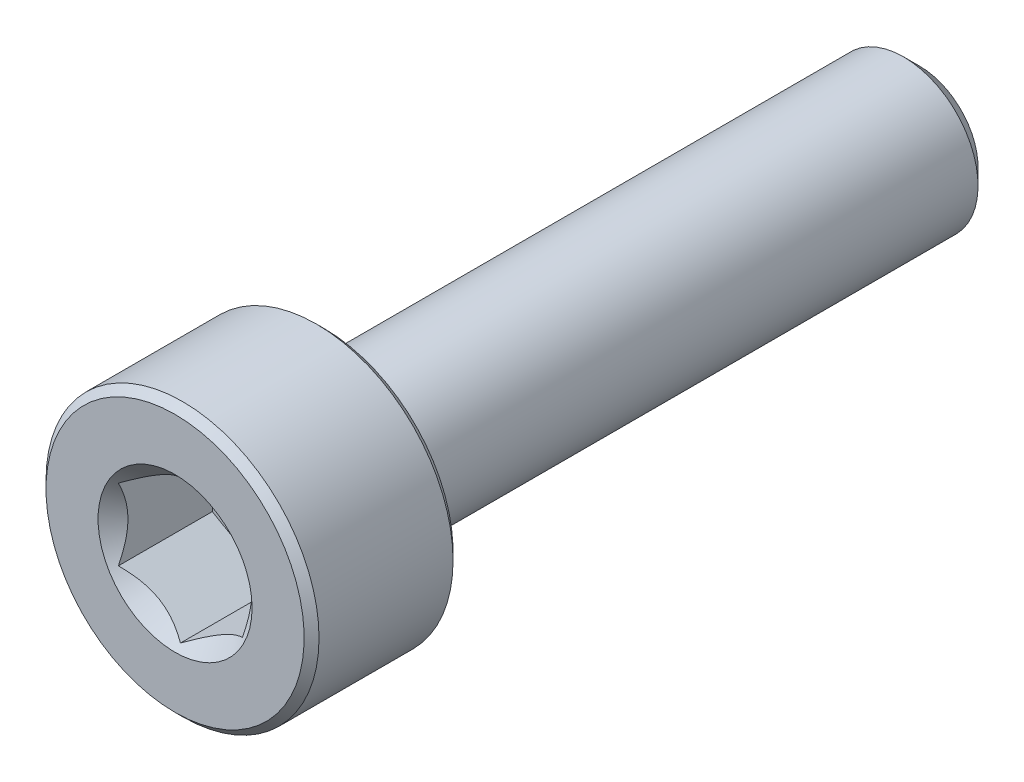
ISO-10303-21;
HEADER;
FILE_DESCRIPTION(('STEP AP214'),'2;1');
FILE_NAME('part.step','',(''),(''),'','','');
FILE_SCHEMA(('AUTOMOTIVE_DESIGN { 1 0 10303 214 1 1 1 1 }'));
ENDSEC;
DATA;
#1=APPLICATION_CONTEXT('core data for automotive mechanical design processes');
#2=APPLICATION_PROTOCOL_DEFINITION('international standard','automotive_design',2000,#1);
#3=PRODUCT_CONTEXT('',#1,'mechanical');
#4=PRODUCT('Part','Part','',(#3));
#5=PRODUCT_RELATED_PRODUCT_CATEGORY('part','',(#4));
#6=PRODUCT_DEFINITION_FORMATION('','',#4);
#7=PRODUCT_DEFINITION_CONTEXT('part definition',#1,'design');
#8=PRODUCT_DEFINITION('design','',#6,#7);
#9=PRODUCT_DEFINITION_SHAPE('','',#8);
#10=(LENGTH_UNIT() NAMED_UNIT(*) SI_UNIT(.MILLI.,.METRE.));
#11=(NAMED_UNIT(*) PLANE_ANGLE_UNIT() SI_UNIT($,.RADIAN.));
#12=(NAMED_UNIT(*) SI_UNIT($,.STERADIAN.) SOLID_ANGLE_UNIT());
#13=UNCERTAINTY_MEASURE_WITH_UNIT(LENGTH_MEASURE(1.E-05),#10,'distance_accuracy_value','');
#14=(GEOMETRIC_REPRESENTATION_CONTEXT(3) GLOBAL_UNCERTAINTY_ASSIGNED_CONTEXT((#13)) GLOBAL_UNIT_ASSIGNED_CONTEXT((#10,
#11,#12)) REPRESENTATION_CONTEXT('',''));
#15=CARTESIAN_POINT('',(0.,0.,0.));
#16=DIRECTION('',(0.,0.,1.));
#17=DIRECTION('',(1.,0.,0.));
#18=AXIS2_PLACEMENT_3D('',#15,#16,#17);
#19=CARTESIAN_POINT('',(0.,1.17524047358084,-7.5));
#20=DIRECTION('',(0.,0.,-1.));
#21=DIRECTION('',(0.,1.,0.));
#22=AXIS2_PLACEMENT_3D('',#19,#20,#21);
#23=PLANE('',#22);
#24=CARTESIAN_POINT('',(0.,0.,-7.5));
#25=DIRECTION('',(0.,0.,-1.));
#26=DIRECTION('',(0.,1.,0.));
#27=AXIS2_PLACEMENT_3D('',#24,#25,#26);
#28=CIRCLE('',#27,1.17524047358084);
#29=CARTESIAN_POINT('',(0.,1.17524047358084,-7.5));
#30=VERTEX_POINT('',#29);
#31=EDGE_CURVE('E53',#30,#30,#28,.T.);
#32=ORIENTED_EDGE('',*,*,#31,.T.);
#33=EDGE_LOOP('',(#32));
#34=FACE_BOUND('',#33,.T.);
#35=ADVANCED_FACE('F40',(#34),#23,.T.);
#36=CARTESIAN_POINT('',(0.,0.,-7.5));
#37=DIRECTION('',(0.,0.,1.));
#38=DIRECTION('',(0.,-1.,0.));
#39=AXIS2_PLACEMENT_3D('',#36,#37,#38);
#40=CONICAL_SURFACE('',#39,1.17524047358084,0.785398163397446);
#41=CARTESIAN_POINT('',(0.,0.,-7.17524047358083));
#42=DIRECTION('',(0.,0.,-1.));
#43=DIRECTION('',(0.,1.,0.));
#44=AXIS2_PLACEMENT_3D('',#41,#42,#43);
#45=CIRCLE('',#44,1.5);
#46=CARTESIAN_POINT('',(0.,1.5,-7.17524047358083));
#47=VERTEX_POINT('',#46);
#48=EDGE_CURVE('E156',#47,#47,#45,.T.);
#49=ORIENTED_EDGE('',*,*,#48,.T.);
#50=EDGE_LOOP('',(#49));
#51=FACE_BOUND('',#50,.T.);
#52=ORIENTED_EDGE('',*,*,#31,.F.);
#53=EDGE_LOOP('',(#52));
#54=FACE_BOUND('',#53,.T.);
#55=ADVANCED_FACE('F162',(#51,#54),#40,.T.);
#56=CARTESIAN_POINT('',(0.,0.,-7.5));
#57=DIRECTION('',(0.,0.,-1.));
#58=DIRECTION('',(0.,1.,0.));
#59=AXIS2_PLACEMENT_3D('',#56,#57,#58);
#60=CYLINDRICAL_SURFACE('',#59,1.5);
#61=CARTESIAN_POINT('',(0.,0.,4.35));
#62=DIRECTION('',(0.,0.,-1.));
#63=DIRECTION('',(0.,1.,0.));
#64=AXIS2_PLACEMENT_3D('',#61,#62,#63);
#65=CIRCLE('',#64,1.5);
#66=CARTESIAN_POINT('',(0.,1.5,4.35));
#67=VERTEX_POINT('',#66);
#68=EDGE_CURVE('E153',#67,#67,#65,.T.);
#69=ORIENTED_EDGE('',*,*,#68,.T.);
#70=EDGE_LOOP('',(#69));
#71=FACE_BOUND('',#70,.T.);
#72=ORIENTED_EDGE('',*,*,#48,.F.);
#73=EDGE_LOOP('',(#72));
#74=FACE_BOUND('',#73,.T.);
#75=ADVANCED_FACE('F164',(#71,#74),#60,.T.);
#76=CARTESIAN_POINT('',(0.,0.,4.35));
#77=DIRECTION('',(0.,0.,-1.));
#78=DIRECTION('',(0.,1.,0.));
#79=AXIS2_PLACEMENT_3D('',#76,#77,#78);
#80=TOROIDAL_SURFACE('',#79,1.65,0.149999999999999);
#81=CARTESIAN_POINT('',(0.,0.,4.5));
#82=DIRECTION('',(0.,0.,-1.));
#83=DIRECTION('',(0.,1.,0.));
#84=AXIS2_PLACEMENT_3D('',#81,#82,#83);
#85=CIRCLE('',#84,1.65);
#86=CARTESIAN_POINT('',(0.,1.65,4.5));
#87=VERTEX_POINT('',#86);
#88=EDGE_CURVE('E150',#87,#87,#85,.T.);
#89=ORIENTED_EDGE('',*,*,#88,.T.);
#90=EDGE_LOOP('',(#89));
#91=FACE_BOUND('',#90,.T.);
#92=ORIENTED_EDGE('',*,*,#68,.F.);
#93=EDGE_LOOP('',(#92));
#94=FACE_BOUND('',#93,.T.);
#95=ADVANCED_FACE('F170',(#91,#94),#80,.F.);
#96=CARTESIAN_POINT('',(0.,2.6,4.5));
#97=DIRECTION('',(0.,0.,-1.));
#98=DIRECTION('',(0.,1.,0.));
#99=AXIS2_PLACEMENT_3D('',#96,#97,#98);
#100=PLANE('',#99);
#101=CARTESIAN_POINT('',(0.,0.,4.5));
#102=DIRECTION('',(0.,0.,-1.));
#103=DIRECTION('',(0.,1.,0.));
#104=AXIS2_PLACEMENT_3D('',#101,#102,#103);
#105=CIRCLE('',#104,2.6);
#106=CARTESIAN_POINT('',(0.,2.6,4.5));
#107=VERTEX_POINT('',#106);
#108=EDGE_CURVE('E147',#107,#107,#105,.T.);
#109=ORIENTED_EDGE('',*,*,#108,.T.);
#110=EDGE_LOOP('',(#109));
#111=FACE_BOUND('',#110,.T.);
#112=ORIENTED_EDGE('',*,*,#88,.F.);
#113=EDGE_LOOP('',(#112));
#114=FACE_BOUND('',#113,.T.);
#115=ADVANCED_FACE('F176',(#111,#114),#100,.T.);
#116=CARTESIAN_POINT('',(0.,0.,4.5));
#117=DIRECTION('',(0.,0.,1.));
#118=DIRECTION('',(0.,-1.,0.));
#119=AXIS2_PLACEMENT_3D('',#116,#117,#118);
#120=CONICAL_SURFACE('',#119,2.6,0.785398163397451);
#121=CARTESIAN_POINT('',(0.,0.,4.65));
#122=DIRECTION('',(0.,0.,-1.));
#123=DIRECTION('',(0.,1.,0.));
#124=AXIS2_PLACEMENT_3D('',#121,#122,#123);
#125=CIRCLE('',#124,2.75);
#126=CARTESIAN_POINT('',(0.,2.75,4.65));
#127=VERTEX_POINT('',#126);
#128=EDGE_CURVE('E144',#127,#127,#125,.T.);
#129=ORIENTED_EDGE('',*,*,#128,.T.);
#130=EDGE_LOOP('',(#129));
#131=FACE_BOUND('',#130,.T.);
#132=ORIENTED_EDGE('',*,*,#108,.F.);
#133=EDGE_LOOP('',(#132));
#134=FACE_BOUND('',#133,.T.);
#135=ADVANCED_FACE('F180',(#131,#134),#120,.T.);
#136=CARTESIAN_POINT('',(0.,0.,-7.5));
#137=DIRECTION('',(0.,0.,-1.));
#138=DIRECTION('',(0.,1.,0.));
#139=AXIS2_PLACEMENT_3D('',#136,#137,#138);
#140=CYLINDRICAL_SURFACE('',#139,2.75);
#141=CARTESIAN_POINT('',(0.,0.,7.35));
#142=DIRECTION('',(0.,0.,-1.));
#143=DIRECTION('',(0.,1.,0.));
#144=AXIS2_PLACEMENT_3D('',#141,#142,#143);
#145=CIRCLE('',#144,2.75);
#146=CARTESIAN_POINT('',(0.,2.75,7.35));
#147=VERTEX_POINT('',#146);
#148=EDGE_CURVE('E141',#147,#147,#145,.T.);
#149=ORIENTED_EDGE('',*,*,#148,.T.);
#150=EDGE_LOOP('',(#149));
#151=FACE_BOUND('',#150,.T.);
#152=ORIENTED_EDGE('',*,*,#128,.F.);
#153=EDGE_LOOP('',(#152));
#154=FACE_BOUND('',#153,.T.);
#155=ADVANCED_FACE('F184',(#151,#154),#140,.T.);
#156=CARTESIAN_POINT('',(0.,0.,7.35));
#157=DIRECTION('',(0.,0.,-1.));
#158=DIRECTION('',(0.,1.,0.));
#159=AXIS2_PLACEMENT_3D('',#156,#157,#158);
#160=CONICAL_SURFACE('',#159,2.75,0.785398163397445);
#161=CARTESIAN_POINT('',(0.,0.,7.5));
#162=DIRECTION('',(0.,0.,-1.));
#163=DIRECTION('',(0.,1.,0.));
#164=AXIS2_PLACEMENT_3D('',#161,#162,#163);
#165=CIRCLE('',#164,2.6);
#166=CARTESIAN_POINT('',(0.,2.6,7.5));
#167=VERTEX_POINT('',#166);
#168=EDGE_CURVE('E138',#167,#167,#165,.T.);
#169=ORIENTED_EDGE('',*,*,#168,.T.);
#170=EDGE_LOOP('',(#169));
#171=FACE_BOUND('',#170,.T.);
#172=ORIENTED_EDGE('',*,*,#148,.F.);
#173=EDGE_LOOP('',(#172));
#174=FACE_BOUND('',#173,.T.);
#175=ADVANCED_FACE('F188',(#171,#174),#160,.T.);
#176=CARTESIAN_POINT('',(0.,0.,7.5));
#177=DIRECTION('',(0.,0.,1.));
#178=DIRECTION('',(0.,-1.,0.));
#179=AXIS2_PLACEMENT_3D('',#176,#177,#178);
#180=PLANE('',#179);
#181=CARTESIAN_POINT('',(0.,0.,7.5));
#182=DIRECTION('',(0.,0.,1.));
#183=DIRECTION('',(1.,0.,0.));
#184=AXIS2_PLACEMENT_3D('',#181,#182,#183);
#185=CIRCLE('',#184,1.55162884844712);
#186=CARTESIAN_POINT('',(1.55162884844712,0.,7.5));
#187=VERTEX_POINT('',#186);
#188=EDGE_CURVE('E112',#187,#187,#185,.T.);
#189=ORIENTED_EDGE('',*,*,#188,.F.);
#190=EDGE_LOOP('',(#189));
#191=FACE_BOUND('',#190,.T.);
#192=ORIENTED_EDGE('',*,*,#168,.F.);
#193=EDGE_LOOP('',(#192));
#194=FACE_BOUND('',#193,.T.);
#195=ADVANCED_FACE('F192',(#191,#194),#180,.T.);
#196=CARTESIAN_POINT('',(0.,0.,7.5));
#197=DIRECTION('',(0.,0.,1.));
#198=DIRECTION('',(1.,0.,0.));
#199=AXIS2_PLACEMENT_3D('',#196,#197,#198);
#200=CONICAL_SURFACE('',#199,1.55162884844712,0.78539816339745);
#201=ORIENTED_EDGE('',*,*,#188,.T.);
#202=EDGE_LOOP('',(#201));
#203=FACE_BOUND('',#202,.T.);
#204=CARTESIAN_POINT('',(-0.000199999999999347,-1.4434911430279,7.39186230843608));
#205=CARTESIAN_POINT('',(0.0427751670715876,-1.41867941875065,7.36706849258205));
#206=CARTESIAN_POINT('',(0.086469004745949,-1.39345276980743,7.34373055894563));
#207=CARTESIAN_POINT('',(0.175565930841943,-1.34201263554194,7.30099882861148));
#208=CARTESIAN_POINT('',(0.220977498357065,-1.31579425481276,7.28162881688736));
#209=CARTESIAN_POINT('',(0.31254782093526,-1.26292610442246,7.24844730794042));
#210=CARTESIAN_POINT('',(0.358683240175886,-1.23628980770471,7.2345523835796));
#211=CARTESIAN_POINT('',(0.451970080407593,-1.18243062538508,7.21314410668758));
#212=CARTESIAN_POINT('',(0.499118649136381,-1.15520938653761,7.20561476609373));
#213=CARTESIAN_POINT('',(0.580373556887253,-1.10829684367467,7.19882132257765));
#214=CARTESIAN_POINT('',(0.614374876627942,-1.08866617256958,7.1978153836313));
#215=CARTESIAN_POINT('',(0.682317764432479,-1.04943932800611,7.19950823943826));
#216=CARTESIAN_POINT('',(0.716259317655659,-1.02984316311599,7.20220785174248));
#217=CARTESIAN_POINT('',(0.783814856457501,-0.990839954603499,7.21115575484332));
#218=CARTESIAN_POINT('',(0.817428507286776,-0.971433104248771,7.21740735042665));
#219=CARTESIAN_POINT('',(0.884094638217814,-0.932943395609905,7.23312250594085));
#220=CARTESIAN_POINT('',(0.917146871030297,-0.9138606800983,7.2425874446144));
#221=CARTESIAN_POINT('',(1.00179969160027,-0.864986351354567,7.27067821521453));
#222=CARTESIAN_POINT('',(1.05286649242964,-0.835502920149076,7.29141698197915));
#223=CARTESIAN_POINT('',(1.15300085411326,-0.777690319475908,7.33813395919842));
#224=CARTESIAN_POINT('',(1.20207431157827,-0.749357745598417,7.36409512047371));
#225=CARTESIAN_POINT('',(1.2502,-0.721572366433194,7.39186230843608));
#226=B_SPLINE_CURVE_WITH_KNOTS('',3,(#204,#205,#206,#207,#208,#209,#210,#211,#212,#213,#214,
#215,#216,#217,#218,#219,#220,#221,#222,#223,#224,#225),.UNSPECIFIED.,.F.,.F.,(4,2,2,2,2,2,2,2,
2,2,4),(0.,0.166533409618304,0.334037607289762,0.498880396489698,0.663307919240275,
0.780963963458827,0.898645970148454,1.01643764860773,1.1342799317155,1.32148652032141,
1.50809158792573),.UNSPECIFIED.);
#227=CARTESIAN_POINT('',(0.,-1.44337567297406,7.39174682452695));
#228=VERTEX_POINT('',#227);
#229=CARTESIAN_POINT('',(1.25,-0.721687836487032,7.39174682452694));
#230=VERTEX_POINT('',#229);
#231=EDGE_CURVE('E12',#228,#230,#226,.T.);
#232=ORIENTED_EDGE('',*,*,#231,.F.);
#233=CARTESIAN_POINT('',(-1.2502,-0.721572366433195,7.39186230843608));
#234=CARTESIAN_POINT('',(-1.20722483292841,-0.746384090710444,7.36706849258205));
#235=CARTESIAN_POINT('',(-1.16353099525405,-0.771610739653664,7.34373055894563));
#236=CARTESIAN_POINT('',(-1.07443406915806,-0.823050873919155,7.30099882861148));
#237=CARTESIAN_POINT('',(-1.02902250164294,-0.849269254648333,7.28162881688736));
#238=CARTESIAN_POINT('',(-0.93745217906474,-0.902137405038636,7.24844730794042));
#239=CARTESIAN_POINT('',(-0.891316759824114,-0.928773701756387,7.2345523835796));
#240=CARTESIAN_POINT('',(-0.798029919592408,-0.982632884076012,7.21314410668758));
#241=CARTESIAN_POINT('',(-0.75088135086362,-1.00985412292348,7.20561476609373));
#242=CARTESIAN_POINT('',(-0.669626443112748,-1.05676666578643,7.19882132257765));
#243=CARTESIAN_POINT('',(-0.635625123372059,-1.07639733689152,7.1978153836313));
#244=CARTESIAN_POINT('',(-0.567682235567523,-1.11562418145499,7.19950823943826));
#245=CARTESIAN_POINT('',(-0.533740682344343,-1.1352203463451,7.20220785174248));
#246=CARTESIAN_POINT('',(-0.466185143542501,-1.1742235548576,7.21115575484332));
#247=CARTESIAN_POINT('',(-0.432571492713225,-1.19363040521233,7.21740735042665));
#248=CARTESIAN_POINT('',(-0.365905361782187,-1.23212011385119,7.23312250594085));
#249=CARTESIAN_POINT('',(-0.332853128969705,-1.2512028293628,7.2425874446144));
#250=CARTESIAN_POINT('',(-0.248200308399736,-1.30007715810653,7.27067821521453));
#251=CARTESIAN_POINT('',(-0.197133507570362,-1.32956058931202,7.29141698197915));
#252=CARTESIAN_POINT('',(-0.0969991458867446,-1.38737318998519,7.33813395919842));
#253=CARTESIAN_POINT('',(-0.0479256884217298,-1.41570576386268,7.36409512047371));
#254=CARTESIAN_POINT('',(0.000200000000000719,-1.4434911430279,7.39186230843608));
#255=B_SPLINE_CURVE_WITH_KNOTS('',3,(#233,#234,#235,#236,#237,#238,#239,#240,#241,#242,#243,
#244,#245,#246,#247,#248,#249,#250,#251,#252,#253,#254),.UNSPECIFIED.,.F.,.F.,(4,2,2,2,2,2,2,2,
2,2,4),(0.,0.166533409618303,0.334037607289761,0.498880396489698,0.663307919240274,
0.780963963458826,0.898645970148452,1.01643764860773,1.13427993171549,1.32148652032141,
1.50809158792574),.UNSPECIFIED.);
#256=CARTESIAN_POINT('',(-1.25,-0.721687836487032,7.39174682452694));
#257=VERTEX_POINT('',#256);
#258=EDGE_CURVE('E98',#257,#228,#255,.T.);
#259=ORIENTED_EDGE('',*,*,#258,.F.);
#260=CARTESIAN_POINT('',(-1.25,-1.52022146239345,7.91651070319084));
#261=CARTESIAN_POINT('',(-1.25,-1.48354689134962,7.88818689718723));
#262=CARTESIAN_POINT('',(-1.25,-1.44667707589305,7.86011672093047));
#263=CARTESIAN_POINT('',(-1.25,-1.37246477804769,7.80459065501776));
#264=CARTESIAN_POINT('',(-1.25,-1.33512218721453,7.77713491044787));
#265=CARTESIAN_POINT('',(-1.25,-1.22171630832114,7.69545809771049));
#266=CARTESIAN_POINT('',(-1.25,-1.14482995781092,7.6423614251193));
#267=CARTESIAN_POINT('',(-1.25,-0.983056768942587,7.53734973416941));
#268=CARTESIAN_POINT('',(-1.25,-0.897974111811057,7.48573326925832));
#269=CARTESIAN_POINT('',(-1.25,-0.723462355215556,7.39078355108508));
#270=CARTESIAN_POINT('',(-1.25,-0.634049271919706,7.34742232185916));
#271=CARTESIAN_POINT('',(-1.25,-0.5005887711437,7.29435177040724));
#272=CARTESIAN_POINT('',(-1.25,-0.45869172620811,7.27926501327173));
#273=CARTESIAN_POINT('',(-1.25,-0.373815329706778,7.25244749770266));
#274=CARTESIAN_POINT('',(-1.25,-0.330835910419723,7.24071694982871));
#275=CARTESIAN_POINT('',(-1.25,-0.244810833071148,7.22144313304601));
#276=CARTESIAN_POINT('',(-1.25,-0.20178270746757,7.21382289169453));
#277=CARTESIAN_POINT('',(-1.25,-0.115176247984994,7.20293190707962));
#278=CARTESIAN_POINT('',(-1.25,-0.0715980347745591,7.1996602260857));
#279=CARTESIAN_POINT('',(-1.25,0.0136806197531973,7.19775210045869));
#280=CARTESIAN_POINT('',(-1.25,0.0553765370047054,7.19891205716704));
#281=CARTESIAN_POINT('',(-1.25,0.138449096453161,7.20533266388464));
#282=CARTESIAN_POINT('',(-1.25,0.179825709781943,7.21059368038276));
#283=CARTESIAN_POINT('',(-1.25,0.262662840763599,7.22500574721218));
#284=CARTESIAN_POINT('',(-1.25,0.304111120669652,7.23422600730023));
#285=CARTESIAN_POINT('',(-1.25,0.386089884230835,7.25604235623938));
#286=CARTESIAN_POINT('',(-1.25,0.426620414510369,7.26863827317792));
#287=CARTESIAN_POINT('',(-1.25,0.550794781768363,7.31205959164791));
#288=CARTESIAN_POINT('',(-1.25,0.632755591043413,7.34768282700966));
#289=CARTESIAN_POINT('',(-1.25,0.792852508946384,7.42696814455953));
#290=CARTESIAN_POINT('',(-1.25,0.870973935410877,7.47065844211049));
#291=CARTESIAN_POINT('',(-1.25,1.02031328199646,7.56088158787621));
#292=CARTESIAN_POINT('',(-1.25,1.09168171050215,7.60716845879521));
#293=CARTESIAN_POINT('',(-1.25,1.19682802849918,7.67876149953674));
#294=CARTESIAN_POINT('',(-1.25,1.2314248214359,7.70288582787532));
#295=CARTESIAN_POINT('',(-1.25,1.30014350643268,7.75178258410313));
#296=CARTESIAN_POINT('',(-1.25,1.33426552680451,7.7765548314612));
#297=CARTESIAN_POINT('',(-1.25,1.36818950249276,7.8015960474388));
#298=B_SPLINE_CURVE_WITH_KNOTS('',3,(#260,#261,#262,#263,#264,#265,#266,#267,#268,#269,#270,
#271,#272,#273,#274,#275,#276,#277,#278,#279,#280,#281,#282,#283,#284,#285,#286,#287,#288,#289,
#290,#291,#292,#293,#294,#295,#296,#297),.UNSPECIFIED.,.F.,.F.,(4,2,2,2,2,2,2,2,2,2,2,2,2,2,2,2,
2,2,4),(0.,0.139012369615043,0.278057225136917,0.558259504053769,0.856585057342473,
1.15388088887298,1.28736138903992,1.42085026158167,1.55174393609413,1.68260937990424,
1.80753647715252,1.93247473971975,2.05969207441603,2.18690293152764,2.45422704655832,
2.72250450232039,2.97756898823762,3.10409578574714,3.23058769667827),.UNSPECIFIED.);
#299=CARTESIAN_POINT('',(-1.25,0.721687836487032,7.39174682452694));
#300=VERTEX_POINT('',#299);
#301=EDGE_CURVE('E111',#300,#257,#298,.F.);
#302=ORIENTED_EDGE('',*,*,#301,.F.);
#303=CARTESIAN_POINT('',(0.000199999999999644,1.4434911430279,7.39186230843608));
#304=CARTESIAN_POINT('',(-0.0427751670715868,1.41867941875065,7.36706849258205));
#305=CARTESIAN_POINT('',(-0.0864690047459481,1.39345276980743,7.34373055894563));
#306=CARTESIAN_POINT('',(-0.175565930841942,1.34201263554194,7.30099882861148));
#307=CARTESIAN_POINT('',(-0.220977498357064,1.31579425481276,7.28162881688736));
#308=CARTESIAN_POINT('',(-0.312547820935259,1.26292610442246,7.24844730794042));
#309=CARTESIAN_POINT('',(-0.358683240175885,1.23628980770471,7.2345523835796));
#310=CARTESIAN_POINT('',(-0.451970080407592,1.18243062538508,7.21314410668758));
#311=CARTESIAN_POINT('',(-0.49911864913638,1.15520938653761,7.20561476609373));
#312=CARTESIAN_POINT('',(-0.580373556887252,1.10829684367467,7.19882132257765));
#313=CARTESIAN_POINT('',(-0.614374876627941,1.08866617256958,7.1978153836313));
#314=CARTESIAN_POINT('',(-0.682317764432477,1.04943932800611,7.19950823943826));
#315=CARTESIAN_POINT('',(-0.716259317655657,1.02984316311599,7.20220785174248));
#316=CARTESIAN_POINT('',(-0.783814856457499,0.990839954603499,7.21115575484332));
#317=CARTESIAN_POINT('',(-0.817428507286774,0.971433104248771,7.21740735042665));
#318=CARTESIAN_POINT('',(-0.884094638217813,0.932943395609905,7.23312250594085));
#319=CARTESIAN_POINT('',(-0.917146871030295,0.9138606800983,7.2425874446144));
#320=CARTESIAN_POINT('',(-1.00179969160026,0.864986351354567,7.27067821521453));
#321=CARTESIAN_POINT('',(-1.05286649242964,0.835502920149075,7.29141698197915));
#322=CARTESIAN_POINT('',(-1.15300085411325,0.777690319475908,7.33813395919842));
#323=CARTESIAN_POINT('',(-1.20207431157827,0.749357745598416,7.36409512047371));
#324=CARTESIAN_POINT('',(-1.2502,0.721572366433194,7.39186230843608));
#325=B_SPLINE_CURVE_WITH_KNOTS('',3,(#303,#304,#305,#306,#307,#308,#309,#310,#311,#312,#313,
#314,#315,#316,#317,#318,#319,#320,#321,#322,#323,#324),.UNSPECIFIED.,.F.,.F.,(4,2,2,2,2,2,2,2,
2,2,4),(0.,0.166533409618303,0.334037607289761,0.498880396489697,0.663307919240274,
0.780963963458826,0.898645970148452,1.01643764860773,1.13427993171549,1.32148652032141,
1.50809158792574),.UNSPECIFIED.);
#326=CARTESIAN_POINT('',(0.,1.44337567297406,7.39174682452694));
#327=VERTEX_POINT('',#326);
#328=EDGE_CURVE('E242',#327,#300,#325,.T.);
#329=ORIENTED_EDGE('',*,*,#328,.F.);
#330=CARTESIAN_POINT('',(1.2502,0.721572366433194,7.39186230843608));
#331=CARTESIAN_POINT('',(1.20722483292841,0.746384090710444,7.36706849258205));
#332=CARTESIAN_POINT('',(1.16353099525405,0.771610739653664,7.34373055894563));
#333=CARTESIAN_POINT('',(1.07443406915806,0.823050873919154,7.30099882861148));
#334=CARTESIAN_POINT('',(1.02902250164294,0.849269254648333,7.28162881688736));
#335=CARTESIAN_POINT('',(0.93745217906474,0.902137405038635,7.24844730794042));
#336=CARTESIAN_POINT('',(0.891316759824114,0.928773701756387,7.2345523835796));
#337=CARTESIAN_POINT('',(0.798029919592408,0.982632884076012,7.21314410668758));
#338=CARTESIAN_POINT('',(0.750881350863621,1.00985412292348,7.20561476609373));
#339=CARTESIAN_POINT('',(0.669626443112748,1.05676666578643,7.19882132257765));
#340=CARTESIAN_POINT('',(0.635625123372059,1.07639733689152,7.19781538363129));
#341=CARTESIAN_POINT('',(0.567682235567523,1.11562418145499,7.19950823943826));
#342=CARTESIAN_POINT('',(0.533740682344343,1.1352203463451,7.20220785174248));
#343=CARTESIAN_POINT('',(0.466185143542501,1.1742235548576,7.21115575484332));
#344=CARTESIAN_POINT('',(0.432571492713225,1.19363040521233,7.21740735042665));
#345=CARTESIAN_POINT('',(0.365905361782187,1.23212011385119,7.23312250594085));
#346=CARTESIAN_POINT('',(0.332853128969705,1.2512028293628,7.2425874446144));
#347=CARTESIAN_POINT('',(0.248200308399736,1.30007715810653,7.27067821521453));
#348=CARTESIAN_POINT('',(0.197133507570362,1.32956058931202,7.29141698197915));
#349=CARTESIAN_POINT('',(0.0969991458867456,1.38737318998519,7.33813395919842));
#350=CARTESIAN_POINT('',(0.0479256884217306,1.41570576386268,7.36409512047371));
#351=CARTESIAN_POINT('',(-0.000200000000000208,1.4434911430279,7.39186230843608));
#352=B_SPLINE_CURVE_WITH_KNOTS('',3,(#330,#331,#332,#333,#334,#335,#336,#337,#338,#339,#340,
#341,#342,#343,#344,#345,#346,#347,#348,#349,#350,#351),.UNSPECIFIED.,.F.,.F.,(4,2,2,2,2,2,2,2,
2,2,4),(0.,0.166533409618303,0.334037607289761,0.498880396489698,0.663307919240274,
0.780963963458826,0.898645970148452,1.01643764860773,1.13427993171549,1.32148652032141,
1.50809158792574),.UNSPECIFIED.);
#353=CARTESIAN_POINT('',(1.25,0.721687836487032,7.39174682452694));
#354=VERTEX_POINT('',#353);
#355=EDGE_CURVE('E215',#354,#327,#352,.T.);
#356=ORIENTED_EDGE('',*,*,#355,.F.);
#357=CARTESIAN_POINT('',(1.25,-1.52022146239345,7.91651070319084));
#358=CARTESIAN_POINT('',(1.25,-1.48354689134962,7.88818689718723));
#359=CARTESIAN_POINT('',(1.25,-1.44667707589305,7.86011672093047));
#360=CARTESIAN_POINT('',(1.25,-1.37246477804769,7.80459065501776));
#361=CARTESIAN_POINT('',(1.25,-1.33512218721453,7.77713491044787));
#362=CARTESIAN_POINT('',(1.25,-1.22171630832114,7.69545809771049));
#363=CARTESIAN_POINT('',(1.25,-1.14482995781092,7.6423614251193));
#364=CARTESIAN_POINT('',(1.25,-0.983056768942586,7.53734973416941));
#365=CARTESIAN_POINT('',(1.25,-0.897974111811055,7.48573326925832));
#366=CARTESIAN_POINT('',(1.25,-0.723462355215555,7.39078355108508));
#367=CARTESIAN_POINT('',(1.25,-0.634049271919706,7.34742232185916));
#368=CARTESIAN_POINT('',(1.25,-0.500588771143699,7.29435177040724));
#369=CARTESIAN_POINT('',(1.25,-0.45869172620811,7.27926501327173));
#370=CARTESIAN_POINT('',(1.25,-0.373815329706778,7.25244749770266));
#371=CARTESIAN_POINT('',(1.25,-0.330835910419723,7.24071694982871));
#372=CARTESIAN_POINT('',(1.25,-0.244810833071148,7.22144313304601));
#373=CARTESIAN_POINT('',(1.25,-0.20178270746757,7.21382289169453));
#374=CARTESIAN_POINT('',(1.25,-0.115176247984995,7.20293190707962));
#375=CARTESIAN_POINT('',(1.25,-0.0715980347745595,7.1996602260857));
#376=CARTESIAN_POINT('',(1.25,0.0136806197531967,7.19775210045869));
#377=CARTESIAN_POINT('',(1.25,0.0553765370047049,7.19891205716704));
#378=CARTESIAN_POINT('',(1.25,0.13844909645316,7.20533266388464));
#379=CARTESIAN_POINT('',(1.25,0.179825709781942,7.21059368038276));
#380=CARTESIAN_POINT('',(1.25,0.262662840763599,7.22500574721218));
#381=CARTESIAN_POINT('',(1.25,0.304111120669651,7.23422600730023));
#382=CARTESIAN_POINT('',(1.25,0.386089884230835,7.25604235623938));
#383=CARTESIAN_POINT('',(1.25,0.426620414510369,7.26863827317792));
#384=CARTESIAN_POINT('',(1.25,0.550794781768362,7.31205959164791));
#385=CARTESIAN_POINT('',(1.25,0.632755591043412,7.34768282700966));
#386=CARTESIAN_POINT('',(1.25,0.792852508946383,7.42696814455953));
#387=CARTESIAN_POINT('',(1.25,0.870973935410876,7.47065844211049));
#388=CARTESIAN_POINT('',(1.25,1.02031328199646,7.56088158787621));
#389=CARTESIAN_POINT('',(1.25,1.09168171050215,7.60716845879521));
#390=CARTESIAN_POINT('',(1.25,1.19682802849918,7.67876149953674));
#391=CARTESIAN_POINT('',(1.25,1.2314248214359,7.70288582787532));
#392=CARTESIAN_POINT('',(1.25,1.30014350643268,7.75178258410313));
#393=CARTESIAN_POINT('',(1.25,1.33426552680451,7.7765548314612));
#394=CARTESIAN_POINT('',(1.25,1.36818950249276,7.8015960474388));
#395=B_SPLINE_CURVE_WITH_KNOTS('',3,(#357,#358,#359,#360,#361,#362,#363,#364,#365,#366,#367,
#368,#369,#370,#371,#372,#373,#374,#375,#376,#377,#378,#379,#380,#381,#382,#383,#384,#385,#386,
#387,#388,#389,#390,#391,#392,#393,#394),.UNSPECIFIED.,.F.,.F.,(4,2,2,2,2,2,2,2,2,2,2,2,2,2,2,2,
2,2,4),(0.,0.139012369615044,0.278057225136917,0.558259504053771,0.856585057342474,
1.15388088887299,1.28736138903992,1.42085026158167,1.55174393609413,1.68260937990424,
1.80753647715252,1.93247473971975,2.05969207441603,2.18690293152764,2.45422704655832,
2.72250450232039,2.97756898823762,3.10409578574714,3.23058769667827),.UNSPECIFIED.);
#396=EDGE_CURVE('E60',#230,#354,#395,.T.);
#397=ORIENTED_EDGE('',*,*,#396,.F.);
#398=EDGE_LOOP('',(#232,#259,#302,#329,#356,#397));
#399=FACE_BOUND('',#398,.T.);
#400=ADVANCED_FACE('F97',(#203,#399),#200,.F.);
#401=CARTESIAN_POINT('',(0.,2.6,5.5));
#402=DIRECTION('',(0.,0.,-1.));
#403=DIRECTION('',(0.,1.,0.));
#404=AXIS2_PLACEMENT_3D('',#401,#402,#403);
#405=PLANE('',#404);
#406=DIRECTION('',(0.866025403784438,0.5,0.));
#407=VECTOR('',#406,1.);
#408=CARTESIAN_POINT('',(0.,-1.44337567297406,5.5));
#409=LINE('',#408,#407);
#410=CARTESIAN_POINT('',(0.,-1.44337567297406,5.5));
#411=VERTEX_POINT('',#410);
#412=CARTESIAN_POINT('',(1.25,-0.721687836487032,5.5));
#413=VERTEX_POINT('',#412);
#414=EDGE_CURVE('E115',#411,#413,#409,.T.);
#415=ORIENTED_EDGE('',*,*,#414,.T.);
#416=DIRECTION('',(0.,1.,0.));
#417=VECTOR('',#416,1.);
#418=CARTESIAN_POINT('',(1.25,-0.721687836487032,5.5));
#419=LINE('',#418,#417);
#420=CARTESIAN_POINT('',(1.25,0.721687836487032,5.5));
#421=VERTEX_POINT('',#420);
#422=EDGE_CURVE('E67',#413,#421,#419,.T.);
#423=ORIENTED_EDGE('',*,*,#422,.T.);
#424=DIRECTION('',(-0.866025403784439,0.5,0.));
#425=VECTOR('',#424,1.);
#426=CARTESIAN_POINT('',(1.25,0.721687836487032,5.5));
#427=LINE('',#426,#425);
#428=CARTESIAN_POINT('',(0.,1.44337567297406,5.5));
#429=VERTEX_POINT('',#428);
#430=EDGE_CURVE('E123',#421,#429,#427,.T.);
#431=ORIENTED_EDGE('',*,*,#430,.T.);
#432=DIRECTION('',(-0.866025403784439,-0.5,0.));
#433=VECTOR('',#432,1.);
#434=CARTESIAN_POINT('',(0.,1.44337567297406,5.5));
#435=LINE('',#434,#433);
#436=CARTESIAN_POINT('',(-1.25,0.721687836487032,5.5));
#437=VERTEX_POINT('',#436);
#438=EDGE_CURVE('E130',#429,#437,#435,.T.);
#439=ORIENTED_EDGE('',*,*,#438,.T.);
#440=DIRECTION('',(0.,-1.,0.));
#441=VECTOR('',#440,1.);
#442=CARTESIAN_POINT('',(-1.25,0.721687836487032,5.5));
#443=LINE('',#442,#441);
#444=CARTESIAN_POINT('',(-1.25,-0.721687836487033,5.5));
#445=VERTEX_POINT('',#444);
#446=EDGE_CURVE('E126',#437,#445,#443,.T.);
#447=ORIENTED_EDGE('',*,*,#446,.T.);
#448=DIRECTION('',(0.866025403784439,-0.5,0.));
#449=VECTOR('',#448,1.);
#450=CARTESIAN_POINT('',(-1.25,-0.721687836487032,5.5));
#451=LINE('',#450,#449);
#452=EDGE_CURVE('E116',#445,#411,#451,.T.);
#453=ORIENTED_EDGE('',*,*,#452,.T.);
#454=EDGE_LOOP('',(#415,#423,#431,#439,#447,#453));
#455=FACE_BOUND('',#454,.T.);
#456=ADVANCED_FACE('F197',(#455),#405,.F.);
#457=CARTESIAN_POINT('',(0.,-1.44337567297406,0.681186920870133));
#458=DIRECTION('',(0.5,-0.866025403784438,0.));
#459=DIRECTION('',(0.866025403784438,0.5,0.));
#460=AXIS2_PLACEMENT_3D('',#457,#458,#459);
#461=PLANE('',#460);
#462=DIRECTION('',(0.,0.,1.));
#463=VECTOR('',#462,1.);
#464=CARTESIAN_POINT('',(0.,-1.44337567297406,0.681186920870133));
#465=LINE('',#464,#463);
#466=EDGE_CURVE('E107',#411,#228,#465,.T.);
#467=ORIENTED_EDGE('',*,*,#466,.T.);
#468=ORIENTED_EDGE('',*,*,#231,.T.);
#469=DIRECTION('',(0.,0.,1.));
#470=VECTOR('',#469,1.);
#471=CARTESIAN_POINT('',(1.25,-0.721687836487032,0.681186920870133));
#472=LINE('',#471,#470);
#473=EDGE_CURVE('E118',#413,#230,#472,.T.);
#474=ORIENTED_EDGE('',*,*,#473,.F.);
#475=ORIENTED_EDGE('',*,*,#414,.F.);
#476=EDGE_LOOP('',(#467,#468,#474,#475));
#477=FACE_BOUND('',#476,.T.);
#478=ADVANCED_FACE('F114',(#477),#461,.F.);
#479=CARTESIAN_POINT('',(-1.25,-0.721687836487032,0.681186920870133));
#480=DIRECTION('',(-0.5,-0.866025403784439,0.));
#481=DIRECTION('',(0.866025403784439,-0.5,0.));
#482=AXIS2_PLACEMENT_3D('',#479,#480,#481);
#483=PLANE('',#482);
#484=DIRECTION('',(0.,0.,1.));
#485=VECTOR('',#484,1.);
#486=CARTESIAN_POINT('',(-1.25,-0.721687836487032,0.681186920870133));
#487=LINE('',#486,#485);
#488=EDGE_CURVE('E110',#445,#257,#487,.T.);
#489=ORIENTED_EDGE('',*,*,#488,.T.);
#490=ORIENTED_EDGE('',*,*,#258,.T.);
#491=ORIENTED_EDGE('',*,*,#466,.F.);
#492=ORIENTED_EDGE('',*,*,#452,.F.);
#493=EDGE_LOOP('',(#489,#490,#491,#492));
#494=FACE_BOUND('',#493,.T.);
#495=ADVANCED_FACE('F106',(#494),#483,.F.);
#496=CARTESIAN_POINT('',(-1.25,0.721687836487032,0.681186920870133));
#497=DIRECTION('',(-1.,0.,0.));
#498=DIRECTION('',(0.,0.,1.));
#499=AXIS2_PLACEMENT_3D('',#496,#497,#498);
#500=PLANE('',#499);
#501=DIRECTION('',(0.,0.,1.));
#502=VECTOR('',#501,1.);
#503=CARTESIAN_POINT('',(-1.25,0.721687836487032,0.681186920870133));
#504=LINE('',#503,#502);
#505=EDGE_CURVE('E127',#437,#300,#504,.T.);
#506=ORIENTED_EDGE('',*,*,#505,.T.);
#507=ORIENTED_EDGE('',*,*,#301,.T.);
#508=ORIENTED_EDGE('',*,*,#488,.F.);
#509=ORIENTED_EDGE('',*,*,#446,.F.);
#510=EDGE_LOOP('',(#506,#507,#508,#509));
#511=FACE_BOUND('',#510,.T.);
#512=ADVANCED_FACE('F251',(#511),#500,.F.);
#513=CARTESIAN_POINT('',(0.,1.44337567297406,0.681186920870133));
#514=DIRECTION('',(-0.5,0.866025403784438,0.));
#515=DIRECTION('',(-0.866025403784439,-0.5,0.));
#516=AXIS2_PLACEMENT_3D('',#513,#514,#515);
#517=PLANE('',#516);
#518=DIRECTION('',(0.,0.,1.));
#519=VECTOR('',#518,1.);
#520=CARTESIAN_POINT('',(0.,1.44337567297406,0.681186920870133));
#521=LINE('',#520,#519);
#522=EDGE_CURVE('E131',#429,#327,#521,.T.);
#523=ORIENTED_EDGE('',*,*,#522,.T.);
#524=ORIENTED_EDGE('',*,*,#328,.T.);
#525=ORIENTED_EDGE('',*,*,#505,.F.);
#526=ORIENTED_EDGE('',*,*,#438,.F.);
#527=EDGE_LOOP('',(#523,#524,#525,#526));
#528=FACE_BOUND('',#527,.T.);
#529=ADVANCED_FACE('F248',(#528),#517,.F.);
#530=CARTESIAN_POINT('',(1.25,0.721687836487032,0.681186920870133));
#531=DIRECTION('',(0.5,0.866025403784439,0.));
#532=DIRECTION('',(-0.866025403784439,0.5,0.));
#533=AXIS2_PLACEMENT_3D('',#530,#531,#532);
#534=PLANE('',#533);
#535=DIRECTION('',(0.,0.,1.));
#536=VECTOR('',#535,1.);
#537=CARTESIAN_POINT('',(1.25,0.721687836487032,0.681186920870133));
#538=LINE('',#537,#536);
#539=EDGE_CURVE('E134',#421,#354,#538,.T.);
#540=ORIENTED_EDGE('',*,*,#539,.T.);
#541=ORIENTED_EDGE('',*,*,#355,.T.);
#542=ORIENTED_EDGE('',*,*,#522,.F.);
#543=ORIENTED_EDGE('',*,*,#430,.F.);
#544=EDGE_LOOP('',(#540,#541,#542,#543));
#545=FACE_BOUND('',#544,.T.);
#546=ADVANCED_FACE('F205',(#545),#534,.F.);
#547=CARTESIAN_POINT('',(1.25,-0.721687836487032,0.681186920870133));
#548=DIRECTION('',(1.,0.,0.));
#549=DIRECTION('',(0.,0.,-1.));
#550=AXIS2_PLACEMENT_3D('',#547,#548,#549);
#551=PLANE('',#550);
#552=ORIENTED_EDGE('',*,*,#473,.T.);
#553=ORIENTED_EDGE('',*,*,#396,.T.);
#554=ORIENTED_EDGE('',*,*,#539,.F.);
#555=ORIENTED_EDGE('',*,*,#422,.F.);
#556=EDGE_LOOP('',(#552,#553,#554,#555));
#557=FACE_BOUND('',#556,.T.);
#558=ADVANCED_FACE('F201',(#557),#551,.F.);
#559=CLOSED_SHELL('',(#35,#55,#75,#95,#115,#135,#155,#175,#195,#400,#456,#478,#495,#512,#529,
#546,#558));
#560=MANIFOLD_SOLID_BREP('B2',#559);
#561=ADVANCED_BREP_SHAPE_REPRESENTATION('',(#18,#560),#14);
#562=SHAPE_DEFINITION_REPRESENTATION(#9,#561);
ENDSEC;
END-ISO-10303-21;
